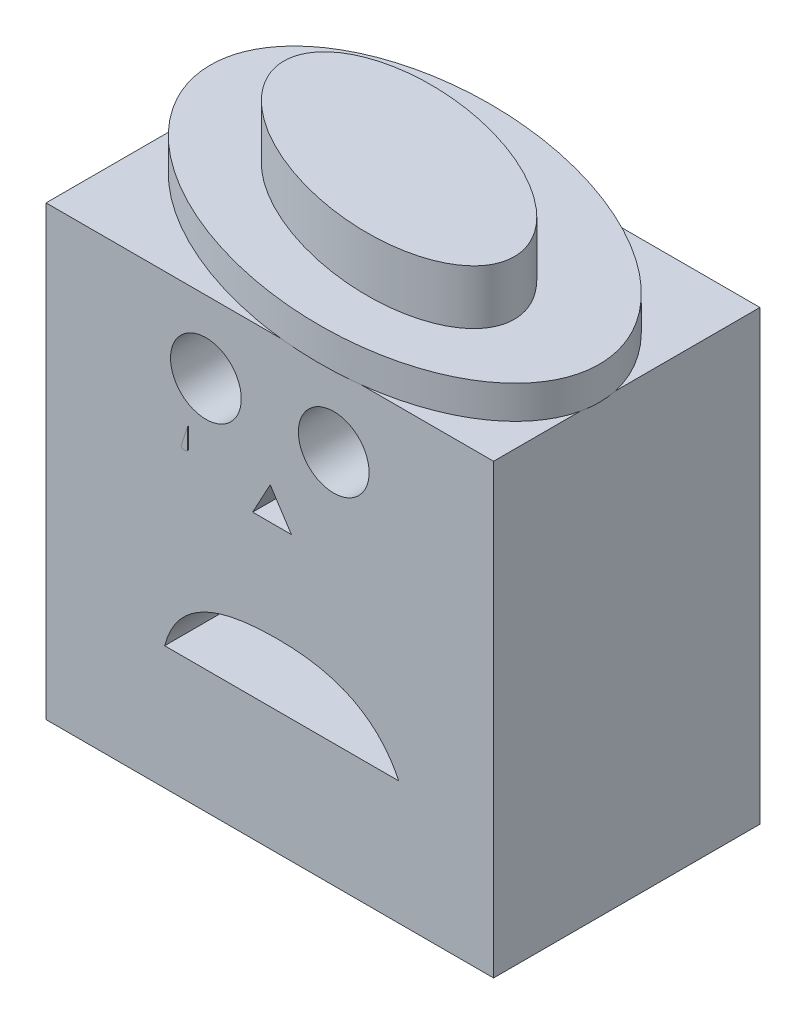
ISO-10303-21;
HEADER;
FILE_DESCRIPTION(('STEP AP214'),'2;1');
FILE_NAME('part.step','',(''),(''),'','','');
FILE_SCHEMA(('AUTOMOTIVE_DESIGN { 1 0 10303 214 1 1 1 1 }'));
ENDSEC;
DATA;
#1=APPLICATION_CONTEXT('core data for automotive mechanical design processes');
#2=APPLICATION_PROTOCOL_DEFINITION('international standard','automotive_design',2000,#1);
#3=PRODUCT_CONTEXT('',#1,'mechanical');
#4=PRODUCT('Part','Part','',(#3));
#5=PRODUCT_RELATED_PRODUCT_CATEGORY('part','',(#4));
#6=PRODUCT_DEFINITION_FORMATION('','',#4);
#7=PRODUCT_DEFINITION_CONTEXT('part definition',#1,'design');
#8=PRODUCT_DEFINITION('design','',#6,#7);
#9=PRODUCT_DEFINITION_SHAPE('','',#8);
#10=(LENGTH_UNIT() NAMED_UNIT(*) SI_UNIT(.MILLI.,.METRE.));
#11=(NAMED_UNIT(*) PLANE_ANGLE_UNIT() SI_UNIT($,.RADIAN.));
#12=(NAMED_UNIT(*) SI_UNIT($,.STERADIAN.) SOLID_ANGLE_UNIT());
#13=UNCERTAINTY_MEASURE_WITH_UNIT(LENGTH_MEASURE(1.E-05),#10,'distance_accuracy_value','');
#14=(GEOMETRIC_REPRESENTATION_CONTEXT(3) GLOBAL_UNCERTAINTY_ASSIGNED_CONTEXT((#13)) GLOBAL_UNIT_ASSIGNED_CONTEXT((#10,
#11,#12)) REPRESENTATION_CONTEXT('',''));
#15=CARTESIAN_POINT('',(0.,0.,0.));
#16=DIRECTION('',(0.,0.,1.));
#17=DIRECTION('',(1.,0.,0.));
#18=AXIS2_PLACEMENT_3D('',#15,#16,#17);
#19=CARTESIAN_POINT('',(0.,773.504412842968,250.));
#20=DIRECTION('',(0.,1.,0.));
#21=DIRECTION('',(0.,0.,1.));
#22=AXIS2_PLACEMENT_3D('',#19,#20,#21);
#23=PLANE('',#22);
#24=CARTESIAN_POINT('',(-1047.35609816267,773.504412842968,122.204602031984));
#25=DIRECTION('',(0.,1.,0.));
#26=DIRECTION('',(-0.977312702499414,0.,-0.211801514473557));
#27=AXIS2_PLACEMENT_3D('',#24,#25,#26);
#28=ELLIPSE('',#27,216.159218744003,124.438636569424);
#29=CARTESIAN_POINT('',(-1256.27696926069,773.504412842968,116.689341842527));
#30=VERTEX_POINT('',#29);
#31=CARTESIAN_POINT('',(-1035.93498476516,773.504412842968,250.));
#32=VERTEX_POINT('',#31);
#33=EDGE_CURVE('E190',#30,#32,#28,.T.);
#34=ORIENTED_EDGE('',*,*,#33,.F.);
#35=DIRECTION('',(0.,0.,-1.));
#36=VECTOR('',#35,1.);
#37=CARTESIAN_POINT('',(-1256.27696926069,773.504412842968,250.));
#38=LINE('',#37,#36);
#39=CARTESIAN_POINT('',(-1256.27696926069,773.504412842968,250.));
#40=VERTEX_POINT('',#39);
#41=EDGE_CURVE('E172',#40,#30,#38,.T.);
#42=ORIENTED_EDGE('',*,*,#41,.F.);
#43=DIRECTION('',(1.,0.,0.));
#44=VECTOR('',#43,1.);
#45=CARTESIAN_POINT('',(0.,773.504412842968,250.));
#46=LINE('',#45,#44);
#47=EDGE_CURVE('E416',#40,#32,#46,.T.);
#48=ORIENTED_EDGE('',*,*,#47,.T.);
#49=EDGE_LOOP('',(#34,#42,#48));
#50=FACE_BOUND('',#49,.T.);
#51=ADVANCED_FACE('F37',(#50),#23,.T.);
#52=CARTESIAN_POINT('',(-960.900420100236,773.504412842968,250.));
#53=VERTEX_POINT('',#52);
#54=CARTESIAN_POINT('',(-836.276969260691,773.504412842968,168.778046732365));
#55=VERTEX_POINT('',#54);
#56=EDGE_CURVE('E11',#53,#55,#28,.T.);
#57=ORIENTED_EDGE('',*,*,#56,.F.);
#58=CARTESIAN_POINT('',(-836.276969260691,773.504412842968,250.));
#59=VERTEX_POINT('',#58);
#60=EDGE_CURVE('E415',#53,#59,#46,.T.);
#61=ORIENTED_EDGE('',*,*,#60,.T.);
#62=DIRECTION('',(0.,0.,-1.));
#63=VECTOR('',#62,1.);
#64=CARTESIAN_POINT('',(-836.276969260691,773.504412842968,250.));
#65=LINE('',#64,#63);
#66=EDGE_CURVE('E209',#59,#55,#65,.T.);
#67=ORIENTED_EDGE('',*,*,#66,.T.);
#68=EDGE_LOOP('',(#57,#61,#67));
#69=FACE_BOUND('',#68,.T.);
#70=ADVANCED_FACE('F304',(#69),#23,.T.);
#71=CARTESIAN_POINT('',(-836.276969260691,773.504412842968,135.862728806255));
#72=VERTEX_POINT('',#71);
#73=CARTESIAN_POINT('',(-1023.7686589662,773.504412842968,0.));
#74=VERTEX_POINT('',#73);
#75=EDGE_CURVE('E46',#72,#74,#28,.T.);
#76=ORIENTED_EDGE('',*,*,#75,.F.);
#77=CARTESIAN_POINT('',(-836.276969260691,773.504412842968,0.));
#78=VERTEX_POINT('',#77);
#79=EDGE_CURVE('E210',#72,#78,#65,.T.);
#80=ORIENTED_EDGE('',*,*,#79,.T.);
#81=DIRECTION('',(1.,0.,0.));
#82=VECTOR('',#81,1.);
#83=CARTESIAN_POINT('',(0.,773.504412842968,0.));
#84=LINE('',#83,#82);
#85=EDGE_CURVE('E261',#74,#78,#84,.T.);
#86=ORIENTED_EDGE('',*,*,#85,.F.);
#87=EDGE_LOOP('',(#76,#80,#86));
#88=FACE_BOUND('',#87,.T.);
#89=ADVANCED_FACE('F310',(#88),#23,.T.);
#90=CARTESIAN_POINT('',(0.,0.,250.));
#91=DIRECTION('',(0.,0.,1.));
#92=DIRECTION('',(1.,0.,0.));
#93=AXIS2_PLACEMENT_3D('',#90,#91,#92);
#94=PLANE('',#93);
#95=CARTESIAN_POINT('',(-986.276969260691,705.792386226511,250.));
#96=DIRECTION('',(0.,0.,1.));
#97=DIRECTION('',(1.,0.,0.));
#98=AXIS2_PLACEMENT_3D('',#95,#96,#97);
#99=CIRCLE('',#98,33.2031338773999);
#100=CARTESIAN_POINT('',(-953.073835383291,705.792386226511,250.));
#101=VERTEX_POINT('',#100);
#102=EDGE_CURVE('E272',#101,#101,#99,.T.);
#103=ORIENTED_EDGE('',*,*,#102,.F.);
#104=EDGE_LOOP('',(#103));
#105=FACE_BOUND('',#104,.T.);
#106=CARTESIAN_POINT('',(-1106.27696926069,705.792386226511,250.));
#107=DIRECTION('',(0.,0.,1.));
#108=DIRECTION('',(1.,0.,0.));
#109=AXIS2_PLACEMENT_3D('',#106,#107,#108);
#110=CIRCLE('',#109,33.2031338773999);
#111=CARTESIAN_POINT('',(-1073.07383538329,705.792386226511,250.));
#112=VERTEX_POINT('',#111);
#113=EDGE_CURVE('E399',#112,#112,#110,.T.);
#114=ORIENTED_EDGE('',*,*,#113,.F.);
#115=EDGE_LOOP('',(#114));
#116=FACE_BOUND('',#115,.T.);
#117=DIRECTION('',(-0.546308724832214,0.83758389261745,0.));
#118=VECTOR('',#117,1.);
#119=CARTESIAN_POINT('',(-436.513870202283,-284.713373673604,250.));
#120=LINE('',#119,#118);
#121=CARTESIAN_POINT('',(-1026.00713709809,619.079743139633,250.));
#122=VERTEX_POINT('',#121);
#123=CARTESIAN_POINT('',(-1045.88994445767,649.563457617213,250.));
#124=VERTEX_POINT('',#123);
#125=EDGE_CURVE('E402',#122,#124,#120,.T.);
#126=ORIENTED_EDGE('',*,*,#125,.F.);
#127=DIRECTION('',(-1.,0.,0.));
#128=VECTOR('',#127,1.);
#129=CARTESIAN_POINT('',(0.,619.079743139633,250.));
#130=LINE('',#129,#128);
#131=CARTESIAN_POINT('',(-1062.40195646636,619.079743139633,250.));
#132=VERTEX_POINT('',#131);
#133=EDGE_CURVE('E232',#122,#132,#130,.T.);
#134=ORIENTED_EDGE('',*,*,#133,.T.);
#135=DIRECTION('',(-0.476283148540754,-0.879291966536773,0.));
#136=VECTOR('',#135,1.);
#137=CARTESIAN_POINT('',(-1080.66631783112,585.360922158528,250.));
#138=LINE('',#137,#136);
#139=EDGE_CURVE('E405',#124,#132,#138,.T.);
#140=ORIENTED_EDGE('',*,*,#139,.F.);
#141=EDGE_LOOP('',(#126,#134,#140));
#142=FACE_BOUND('',#141,.T.);
#143=DIRECTION('',(0.,-1.,0.));
#144=VECTOR('',#143,1.);
#145=CARTESIAN_POINT('',(-1256.27696926069,0.,250.));
#146=LINE('',#145,#144);
#147=CARTESIAN_POINT('',(-1256.27696926069,353.504412842968,250.));
#148=VERTEX_POINT('',#147);
#149=EDGE_CURVE('E407',#40,#148,#146,.T.);
#150=ORIENTED_EDGE('',*,*,#149,.T.);
#151=DIRECTION('',(1.,0.,0.));
#152=VECTOR('',#151,1.);
#153=CARTESIAN_POINT('',(0.,353.504412842968,250.));
#154=LINE('',#153,#152);
#155=CARTESIAN_POINT('',(-836.27696926069,353.504412842968,250.));
#156=VERTEX_POINT('',#155);
#157=EDGE_CURVE('E410',#148,#156,#154,.T.);
#158=ORIENTED_EDGE('',*,*,#157,.T.);
#159=DIRECTION('',(0.,-1.,0.));
#160=VECTOR('',#159,1.);
#161=CARTESIAN_POINT('',(-836.27696926069,-8.84241853559011E-13,250.));
#162=LINE('',#161,#160);
#163=EDGE_CURVE('E412',#59,#156,#162,.T.);
#164=ORIENTED_EDGE('',*,*,#163,.F.);
#165=ORIENTED_EDGE('',*,*,#60,.F.);
#166=EDGE_CURVE('E419',#32,#53,#46,.T.);
#167=ORIENTED_EDGE('',*,*,#166,.F.);
#168=ORIENTED_EDGE('',*,*,#47,.F.);
#169=EDGE_LOOP('',(#150,#158,#164,#165,#167,#168));
#170=FACE_BOUND('',#169,.T.);
#171=DIRECTION('',(1.,0.,0.));
#172=VECTOR('',#171,1.);
#173=CARTESIAN_POINT('',(0.,469.201480291531,250.));
#174=LINE('',#173,#172);
#175=CARTESIAN_POINT('',(-1144.9620165098,469.201480291531,250.));
#176=VERTEX_POINT('',#175);
#177=CARTESIAN_POINT('',(-925.225241317248,469.201480291531,250.));
#178=VERTEX_POINT('',#177);
#179=EDGE_CURVE('E282',#176,#178,#174,.T.);
#180=ORIENTED_EDGE('',*,*,#179,.F.);
#181=CARTESIAN_POINT('',(-1144.9620165098,469.201480291531,250.));
#182=CARTESIAN_POINT('',(-1132.83475985093,516.05542368891,250.));
#183=CARTESIAN_POINT('',(-1038.44686364961,538.622906956385,250.));
#184=CARTESIAN_POINT('',(-948.523344562833,517.634809157185,250.));
#185=CARTESIAN_POINT('',(-925.225241317248,469.201480291531,250.));
#186=B_SPLINE_CURVE_WITH_KNOTS('',3,(#181,#182,#183,#184,#185),.UNSPECIFIED.,.F.,.F.,(4,1,4),
(0.,0.46570079791923,1.),.UNSPECIFIED.);
#187=EDGE_CURVE('E220',#176,#178,#186,.T.);
#188=ORIENTED_EDGE('',*,*,#187,.T.);
#189=EDGE_LOOP('',(#180,#188));
#190=FACE_BOUND('',#189,.T.);
#191=DIRECTION('',(-0.307820285414676,-0.951444518554407,0.));
#192=VECTOR('',#191,1.);
#193=CARTESIAN_POINT('',(-1122.46285109865,659.218542914736,250.));
#194=LINE('',#193,#192);
#195=CARTESIAN_POINT('',(-1122.46285109865,659.218542914736,250.));
#196=VERTEX_POINT('',#195);
#197=CARTESIAN_POINT('',(-1128.53905910145,640.437536360622,250.));
#198=VERTEX_POINT('',#197);
#199=EDGE_CURVE('E366',#196,#198,#194,.T.);
#200=ORIENTED_EDGE('',*,*,#199,.F.);
#201=DIRECTION('',(0.,1.,0.));
#202=VECTOR('',#201,1.);
#203=CARTESIAN_POINT('',(-1122.46285109865,640.00068957891,250.));
#204=LINE('',#203,#202);
#205=CARTESIAN_POINT('',(-1122.46285109865,640.00068957891,250.));
#206=VERTEX_POINT('',#205);
#207=EDGE_CURVE('E202',#206,#196,#204,.T.);
#208=ORIENTED_EDGE('',*,*,#207,.F.);
#209=CARTESIAN_POINT('',(-1123.46285109865,640.00068957891,250.));
#210=DIRECTION('',(0.,0.,-1.));
#211=DIRECTION('',(-1.,0.,0.));
#212=AXIS2_PLACEMENT_3D('',#209,#210,#211);
#213=CIRCLE('',#212,0.999999999999729);
#214=CARTESIAN_POINT('',(-1122.97986029109,639.125064156817,250.));
#215=VERTEX_POINT('',#214);
#216=EDGE_CURVE('E377',#206,#215,#213,.T.);
#217=ORIENTED_EDGE('',*,*,#216,.T.);
#218=CARTESIAN_POINT('',(-1128.12863575861,639.288707105319,250.));
#219=CARTESIAN_POINT('',(-1127.2903383608,638.749430284266,250.));
#220=CARTESIAN_POINT('',(-1125.5822552632,638.182981390083,250.));
#221=CARTESIAN_POINT('',(-1123.85780321633,638.640795025577,250.));
#222=CARTESIAN_POINT('',(-1122.97986029109,639.125064156817,250.));
#223=B_SPLINE_CURVE_WITH_KNOTS('',3,(#218,#219,#220,#221,#222),.UNSPECIFIED.,.F.,.F.,(4,1,4),
(0.103294073645158,0.511857069824513,0.920052958878738),.UNSPECIFIED.);
#224=CARTESIAN_POINT('',(-1128.12863575861,639.288707105319,250.));
#225=VERTEX_POINT('',#224);
#226=EDGE_CURVE('E372',#225,#215,#223,.T.);
#227=ORIENTED_EDGE('',*,*,#226,.F.);
#228=CARTESIAN_POINT('',(-1127.5876145829,640.129716075207,250.));
#229=DIRECTION('',(0.,0.,1.));
#230=DIRECTION('',(1.,0.,0.));
#231=AXIS2_PLACEMENT_3D('',#228,#229,#230);
#232=CIRCLE('',#231,1.00000000000021);
#233=EDGE_CURVE('E369',#198,#225,#232,.T.);
#234=ORIENTED_EDGE('',*,*,#233,.F.);
#235=EDGE_LOOP('',(#200,#208,#217,#227,#234));
#236=FACE_BOUND('',#235,.T.);
#237=ADVANCED_FACE('F324',(#105,#116,#142,#170,#190,#236),#94,.T.);
#238=CARTESIAN_POINT('',(0.,469.201480291531,250.));
#239=DIRECTION('',(0.,1.,0.));
#240=DIRECTION('',(0.,0.,1.));
#241=AXIS2_PLACEMENT_3D('',#238,#239,#240);
#242=PLANE('',#241);
#243=DIRECTION('',(1.,0.,0.));
#244=VECTOR('',#243,1.);
#245=CARTESIAN_POINT('',(0.,469.201480291531,0.));
#246=LINE('',#245,#244);
#247=CARTESIAN_POINT('',(-1144.9620165098,469.201480291531,0.));
#248=VERTEX_POINT('',#247);
#249=CARTESIAN_POINT('',(-925.225241317248,469.201480291531,0.));
#250=VERTEX_POINT('',#249);
#251=EDGE_CURVE('E263',#248,#250,#246,.T.);
#252=ORIENTED_EDGE('',*,*,#251,.F.);
#253=DIRECTION('',(0.,0.,-1.));
#254=VECTOR('',#253,1.);
#255=CARTESIAN_POINT('',(-1144.9620165098,469.201480291531,250.));
#256=LINE('',#255,#254);
#257=EDGE_CURVE('E194',#176,#248,#256,.T.);
#258=ORIENTED_EDGE('',*,*,#257,.F.);
#259=ORIENTED_EDGE('',*,*,#179,.T.);
#260=DIRECTION('',(0.,0.,-1.));
#261=VECTOR('',#260,1.);
#262=CARTESIAN_POINT('',(-925.225241317248,469.201480291531,250.));
#263=LINE('',#262,#261);
#264=EDGE_CURVE('E195',#178,#250,#263,.T.);
#265=ORIENTED_EDGE('',*,*,#264,.T.);
#266=EDGE_LOOP('',(#252,#258,#259,#265));
#267=FACE_BOUND('',#266,.T.);
#268=ADVANCED_FACE('F280',(#267),#242,.T.);
#269=CARTESIAN_POINT('',(-1256.27696926069,0.,250.));
#270=DIRECTION('',(1.,0.,0.));
#271=DIRECTION('',(0.,0.,-1.));
#272=AXIS2_PLACEMENT_3D('',#269,#270,#271);
#273=PLANE('',#272);
#274=DIRECTION('',(0.,-1.,0.));
#275=VECTOR('',#274,1.);
#276=CARTESIAN_POINT('',(-1256.27696926069,0.,0.));
#277=LINE('',#276,#275);
#278=CARTESIAN_POINT('',(-1256.27696926069,773.504412842968,0.));
#279=VERTEX_POINT('',#278);
#280=CARTESIAN_POINT('',(-1256.27696926069,353.504412842968,0.));
#281=VERTEX_POINT('',#280);
#282=EDGE_CURVE('E253',#279,#281,#277,.T.);
#283=ORIENTED_EDGE('',*,*,#282,.T.);
#284=DIRECTION('',(0.,0.,-1.));
#285=VECTOR('',#284,1.);
#286=CARTESIAN_POINT('',(-1256.27696926069,353.504412842968,250.));
#287=LINE('',#286,#285);
#288=EDGE_CURVE('E215',#148,#281,#287,.T.);
#289=ORIENTED_EDGE('',*,*,#288,.F.);
#290=ORIENTED_EDGE('',*,*,#149,.F.);
#291=ORIENTED_EDGE('',*,*,#41,.T.);
#292=CARTESIAN_POINT('',(-1256.27696926069,773.504412842968,68.1041510635131));
#293=VERTEX_POINT('',#292);
#294=EDGE_CURVE('E165',#30,#293,#38,.T.);
#295=ORIENTED_EDGE('',*,*,#294,.T.);
#296=EDGE_CURVE('E169',#293,#279,#38,.T.);
#297=ORIENTED_EDGE('',*,*,#296,.T.);
#298=EDGE_LOOP('',(#283,#289,#290,#291,#295,#297));
#299=FACE_BOUND('',#298,.T.);
#300=ADVANCED_FACE('F168',(#299),#273,.F.);
#301=CARTESIAN_POINT('',(0.,353.504412842968,250.));
#302=DIRECTION('',(0.,1.,0.));
#303=DIRECTION('',(0.,0.,1.));
#304=AXIS2_PLACEMENT_3D('',#301,#302,#303);
#305=PLANE('',#304);
#306=DIRECTION('',(1.,0.,0.));
#307=VECTOR('',#306,1.);
#308=CARTESIAN_POINT('',(0.,353.504412842968,0.));
#309=LINE('',#308,#307);
#310=CARTESIAN_POINT('',(-836.27696926069,353.504412842968,0.));
#311=VERTEX_POINT('',#310);
#312=EDGE_CURVE('E255',#281,#311,#309,.T.);
#313=ORIENTED_EDGE('',*,*,#312,.T.);
#314=DIRECTION('',(0.,0.,-1.));
#315=VECTOR('',#314,1.);
#316=CARTESIAN_POINT('',(-836.27696926069,353.504412842968,250.));
#317=LINE('',#316,#315);
#318=EDGE_CURVE('E212',#156,#311,#317,.T.);
#319=ORIENTED_EDGE('',*,*,#318,.F.);
#320=ORIENTED_EDGE('',*,*,#157,.F.);
#321=ORIENTED_EDGE('',*,*,#288,.T.);
#322=EDGE_LOOP('',(#313,#319,#320,#321));
#323=FACE_BOUND('',#322,.T.);
#324=ADVANCED_FACE('F444',(#323),#305,.F.);
#325=CARTESIAN_POINT('',(-836.27696926069,-8.84241853559011E-13,250.));
#326=DIRECTION('',(1.,0.,0.));
#327=DIRECTION('',(0.,1.,0.));
#328=AXIS2_PLACEMENT_3D('',#325,#326,#327);
#329=PLANE('',#328);
#330=DIRECTION('',(0.,-1.,0.));
#331=VECTOR('',#330,1.);
#332=CARTESIAN_POINT('',(-836.27696926069,-8.84241853559011E-13,0.));
#333=LINE('',#332,#331);
#334=EDGE_CURVE('E258',#78,#311,#333,.T.);
#335=ORIENTED_EDGE('',*,*,#334,.F.);
#336=ORIENTED_EDGE('',*,*,#79,.F.);
#337=EDGE_CURVE('E61',#55,#72,#65,.T.);
#338=ORIENTED_EDGE('',*,*,#337,.F.);
#339=ORIENTED_EDGE('',*,*,#66,.F.);
#340=ORIENTED_EDGE('',*,*,#163,.T.);
#341=ORIENTED_EDGE('',*,*,#318,.T.);
#342=EDGE_LOOP('',(#335,#336,#338,#339,#340,#341));
#343=FACE_BOUND('',#342,.T.);
#344=ADVANCED_FACE('F440',(#343),#329,.T.);
#345=CARTESIAN_POINT('',(-436.513870202283,-284.713373673604,250.));
#346=DIRECTION('',(-0.83758389261745,-0.546308724832214,0.));
#347=DIRECTION('',(0.546308724832214,-0.83758389261745,0.));
#348=AXIS2_PLACEMENT_3D('',#345,#346,#347);
#349=PLANE('',#348);
#350=DIRECTION('',(-0.546308724832214,0.83758389261745,0.));
#351=VECTOR('',#350,1.);
#352=CARTESIAN_POINT('',(-436.513870202283,-284.713373673604,0.));
#353=LINE('',#352,#351);
#354=CARTESIAN_POINT('',(-1026.00713709809,619.079743139633,0.));
#355=VERTEX_POINT('',#354);
#356=CARTESIAN_POINT('',(-1045.88994445767,649.563457617213,0.));
#357=VERTEX_POINT('',#356);
#358=EDGE_CURVE('E241',#355,#357,#353,.T.);
#359=ORIENTED_EDGE('',*,*,#358,.F.);
#360=DIRECTION('',(0.,0.,-1.));
#361=VECTOR('',#360,1.);
#362=CARTESIAN_POINT('',(-1026.00713709809,619.079743139633,250.));
#363=LINE('',#362,#361);
#364=EDGE_CURVE('E41',#122,#355,#363,.T.);
#365=ORIENTED_EDGE('',*,*,#364,.F.);
#366=ORIENTED_EDGE('',*,*,#125,.T.);
#367=DIRECTION('',(0.,0.,-1.));
#368=VECTOR('',#367,1.);
#369=CARTESIAN_POINT('',(-1045.88994445767,649.563457617213,250.));
#370=LINE('',#369,#368);
#371=EDGE_CURVE('E218',#124,#357,#370,.T.);
#372=ORIENTED_EDGE('',*,*,#371,.T.);
#373=EDGE_LOOP('',(#359,#365,#366,#372));
#374=FACE_BOUND('',#373,.T.);
#375=ADVANCED_FACE('F244',(#374),#349,.T.);
#376=CARTESIAN_POINT('',(0.,619.079743139633,250.));
#377=DIRECTION('',(0.,-1.,0.));
#378=DIRECTION('',(0.,0.,-1.));
#379=AXIS2_PLACEMENT_3D('',#376,#377,#378);
#380=PLANE('',#379);
#381=DIRECTION('',(-1.,0.,0.));
#382=VECTOR('',#381,1.);
#383=CARTESIAN_POINT('',(0.,619.079743139633,0.));
#384=LINE('',#383,#382);
#385=CARTESIAN_POINT('',(-1062.40195646636,619.079743139633,0.));
#386=VERTEX_POINT('',#385);
#387=EDGE_CURVE('E230',#355,#386,#384,.T.);
#388=ORIENTED_EDGE('',*,*,#387,.T.);
#389=DIRECTION('',(0.,0.,-1.));
#390=VECTOR('',#389,1.);
#391=CARTESIAN_POINT('',(-1062.40195646636,619.079743139633,250.));
#392=LINE('',#391,#390);
#393=EDGE_CURVE('E219',#132,#386,#392,.T.);
#394=ORIENTED_EDGE('',*,*,#393,.F.);
#395=ORIENTED_EDGE('',*,*,#133,.F.);
#396=ORIENTED_EDGE('',*,*,#364,.T.);
#397=EDGE_LOOP('',(#388,#394,#395,#396));
#398=FACE_BOUND('',#397,.T.);
#399=ADVANCED_FACE('F229',(#398),#380,.F.);
#400=CARTESIAN_POINT('',(-1164.53841275147,773.504412842968,0.));
#401=VERTEX_POINT('',#400);
#402=EDGE_CURVE('E181',#401,#293,#28,.T.);
#403=ORIENTED_EDGE('',*,*,#402,.F.);
#404=EDGE_CURVE('E183',#279,#401,#84,.T.);
#405=ORIENTED_EDGE('',*,*,#404,.F.);
#406=ORIENTED_EDGE('',*,*,#296,.F.);
#407=EDGE_LOOP('',(#403,#405,#406));
#408=FACE_BOUND('',#407,.T.);
#409=ADVANCED_FACE('F179',(#408),#23,.T.);
#410=CARTESIAN_POINT('',(-1080.66631783112,585.360922158528,250.));
#411=DIRECTION('',(0.879291966536773,-0.476283148540754,0.));
#412=DIRECTION('',(0.476283148540754,0.879291966536773,0.));
#413=AXIS2_PLACEMENT_3D('',#410,#411,#412);
#414=PLANE('',#413);
#415=DIRECTION('',(-0.476283148540754,-0.879291966536773,0.));
#416=VECTOR('',#415,1.);
#417=CARTESIAN_POINT('',(-1080.66631783112,585.360922158528,0.));
#418=LINE('',#417,#416);
#419=EDGE_CURVE('E242',#357,#386,#418,.T.);
#420=ORIENTED_EDGE('',*,*,#419,.F.);
#421=ORIENTED_EDGE('',*,*,#371,.F.);
#422=ORIENTED_EDGE('',*,*,#139,.T.);
#423=ORIENTED_EDGE('',*,*,#393,.T.);
#424=EDGE_LOOP('',(#420,#421,#422,#423));
#425=FACE_BOUND('',#424,.T.);
#426=ADVANCED_FACE('F315',(#425),#414,.T.);
#427=CARTESIAN_POINT('',(-1106.27696926069,705.792386226511,250.));
#428=DIRECTION('',(0.,0.,-1.));
#429=DIRECTION('',(-1.,0.,0.));
#430=AXIS2_PLACEMENT_3D('',#427,#428,#429);
#431=CYLINDRICAL_SURFACE('',#430,33.2031338773999);
#432=ORIENTED_EDGE('',*,*,#113,.T.);
#433=EDGE_LOOP('',(#432));
#434=FACE_BOUND('',#433,.T.);
#435=CARTESIAN_POINT('',(-1106.27696926069,705.792386226511,0.));
#436=DIRECTION('',(0.,0.,1.));
#437=DIRECTION('',(1.,0.,0.));
#438=AXIS2_PLACEMENT_3D('',#435,#436,#437);
#439=CIRCLE('',#438,33.2031338773999);
#440=CARTESIAN_POINT('',(-1073.07383538329,705.792386226511,0.));
#441=VERTEX_POINT('',#440);
#442=EDGE_CURVE('E245',#441,#441,#439,.T.);
#443=ORIENTED_EDGE('',*,*,#442,.F.);
#444=EDGE_LOOP('',(#443));
#445=FACE_BOUND('',#444,.T.);
#446=ADVANCED_FACE('F320',(#434,#445),#431,.F.);
#447=CARTESIAN_POINT('',(-986.276969260691,705.792386226511,250.));
#448=DIRECTION('',(0.,0.,-1.));
#449=DIRECTION('',(-1.,0.,0.));
#450=AXIS2_PLACEMENT_3D('',#447,#448,#449);
#451=CYLINDRICAL_SURFACE('',#450,33.2031338773999);
#452=ORIENTED_EDGE('',*,*,#102,.T.);
#453=EDGE_LOOP('',(#452));
#454=FACE_BOUND('',#453,.T.);
#455=CARTESIAN_POINT('',(-986.276969260691,705.792386226511,0.));
#456=DIRECTION('',(0.,0.,1.));
#457=DIRECTION('',(1.,0.,0.));
#458=AXIS2_PLACEMENT_3D('',#455,#456,#457);
#459=CIRCLE('',#458,33.2031338773999);
#460=CARTESIAN_POINT('',(-953.073835383291,705.792386226511,0.));
#461=VERTEX_POINT('',#460);
#462=EDGE_CURVE('E248',#461,#461,#459,.T.);
#463=ORIENTED_EDGE('',*,*,#462,.F.);
#464=EDGE_LOOP('',(#463));
#465=FACE_BOUND('',#464,.T.);
#466=ADVANCED_FACE('F39',(#454,#465),#451,.F.);
#467=DIRECTION('',(0.,0.,-1.));
#468=VECTOR('',#467,1.);
#469=SURFACE_OF_LINEAR_EXTRUSION('',#186,#468);
#470=CARTESIAN_POINT('',(-1144.9620165098,469.201480291531,0.));
#471=CARTESIAN_POINT('',(-1132.83475985093,516.05542368891,0.));
#472=CARTESIAN_POINT('',(-1038.44686364961,538.622906956385,0.));
#473=CARTESIAN_POINT('',(-948.523344562833,517.634809157185,0.));
#474=CARTESIAN_POINT('',(-925.225241317248,469.201480291531,0.));
#475=B_SPLINE_CURVE_WITH_KNOTS('',3,(#470,#471,#472,#473,#474),.UNSPECIFIED.,.F.,.F.,(4,1,4),
(0.,0.46570079791923,1.),.UNSPECIFIED.);
#476=EDGE_CURVE('E267',#248,#250,#475,.T.);
#477=ORIENTED_EDGE('',*,*,#476,.T.);
#478=ORIENTED_EDGE('',*,*,#264,.F.);
#479=ORIENTED_EDGE('',*,*,#187,.F.);
#480=ORIENTED_EDGE('',*,*,#257,.T.);
#481=EDGE_LOOP('',(#477,#478,#479,#480));
#482=FACE_BOUND('',#481,.T.);
#483=ADVANCED_FACE('F286',(#482),#469,.F.);
#484=CARTESIAN_POINT('',(0.,0.,0.));
#485=DIRECTION('',(0.,0.,1.));
#486=DIRECTION('',(1.,0.,0.));
#487=AXIS2_PLACEMENT_3D('',#484,#485,#486);
#488=PLANE('',#487);
#489=ORIENTED_EDGE('',*,*,#462,.T.);
#490=EDGE_LOOP('',(#489));
#491=FACE_BOUND('',#490,.T.);
#492=ORIENTED_EDGE('',*,*,#442,.T.);
#493=EDGE_LOOP('',(#492));
#494=FACE_BOUND('',#493,.T.);
#495=ORIENTED_EDGE('',*,*,#358,.T.);
#496=ORIENTED_EDGE('',*,*,#419,.T.);
#497=ORIENTED_EDGE('',*,*,#387,.F.);
#498=EDGE_LOOP('',(#495,#496,#497));
#499=FACE_BOUND('',#498,.T.);
#500=ORIENTED_EDGE('',*,*,#282,.F.);
#501=ORIENTED_EDGE('',*,*,#404,.T.);
#502=EDGE_CURVE('E264',#401,#74,#84,.T.);
#503=ORIENTED_EDGE('',*,*,#502,.T.);
#504=ORIENTED_EDGE('',*,*,#85,.T.);
#505=ORIENTED_EDGE('',*,*,#334,.T.);
#506=ORIENTED_EDGE('',*,*,#312,.F.);
#507=EDGE_LOOP('',(#500,#501,#503,#504,#505,#506));
#508=FACE_BOUND('',#507,.T.);
#509=ORIENTED_EDGE('',*,*,#251,.T.);
#510=ORIENTED_EDGE('',*,*,#476,.F.);
#511=EDGE_LOOP('',(#509,#510));
#512=FACE_BOUND('',#511,.T.);
#513=ADVANCED_FACE('F239',(#491,#494,#499,#508,#512),#488,.F.);
#514=CARTESIAN_POINT('',(-1122.46285109865,640.00068957891,251.));
#515=DIRECTION('',(-1.,0.,0.));
#516=DIRECTION('',(0.,0.,1.));
#517=AXIS2_PLACEMENT_3D('',#514,#515,#516);
#518=PLANE('',#517);
#519=ORIENTED_EDGE('',*,*,#207,.T.);
#520=DIRECTION('',(0.,0.,-1.));
#521=VECTOR('',#520,1.);
#522=CARTESIAN_POINT('',(-1122.46285109865,659.218542914736,251.));
#523=LINE('',#522,#521);
#524=CARTESIAN_POINT('',(-1122.46285109865,659.218542914736,251.));
#525=VERTEX_POINT('',#524);
#526=EDGE_CURVE('E394',#525,#196,#523,.T.);
#527=ORIENTED_EDGE('',*,*,#526,.F.);
#528=DIRECTION('',(0.,1.,0.));
#529=VECTOR('',#528,1.);
#530=CARTESIAN_POINT('',(-1122.46285109865,640.00068957891,251.));
#531=LINE('',#530,#529);
#532=CARTESIAN_POINT('',(-1122.46285109865,640.00068957891,251.));
#533=VERTEX_POINT('',#532);
#534=EDGE_CURVE('E382',#533,#525,#531,.T.);
#535=ORIENTED_EDGE('',*,*,#534,.F.);
#536=DIRECTION('',(0.,0.,-1.));
#537=VECTOR('',#536,1.);
#538=CARTESIAN_POINT('',(-1122.46285109865,640.00068957891,251.));
#539=LINE('',#538,#537);
#540=EDGE_CURVE('E363',#533,#206,#539,.T.);
#541=ORIENTED_EDGE('',*,*,#540,.T.);
#542=EDGE_LOOP('',(#519,#527,#535,#541));
#543=FACE_BOUND('',#542,.T.);
#544=ADVANCED_FACE('F289',(#543),#518,.F.);
#545=CARTESIAN_POINT('',(-1122.46285109865,659.218542914736,251.));
#546=DIRECTION('',(0.951444518554407,-0.307820285414676,0.));
#547=DIRECTION('',(0.307820285414676,0.951444518554407,0.));
#548=AXIS2_PLACEMENT_3D('',#545,#546,#547);
#549=PLANE('',#548);
#550=ORIENTED_EDGE('',*,*,#199,.T.);
#551=DIRECTION('',(0.,0.,-1.));
#552=VECTOR('',#551,1.);
#553=CARTESIAN_POINT('',(-1128.53905910145,640.437536360622,251.));
#554=LINE('',#553,#552);
#555=CARTESIAN_POINT('',(-1128.53905910145,640.437536360622,251.));
#556=VERTEX_POINT('',#555);
#557=EDGE_CURVE('E391',#556,#198,#554,.T.);
#558=ORIENTED_EDGE('',*,*,#557,.F.);
#559=DIRECTION('',(-0.307820285414676,-0.951444518554407,0.));
#560=VECTOR('',#559,1.);
#561=CARTESIAN_POINT('',(-1122.46285109865,659.218542914736,251.));
#562=LINE('',#561,#560);
#563=EDGE_CURVE('E674',#525,#556,#562,.T.);
#564=ORIENTED_EDGE('',*,*,#563,.F.);
#565=ORIENTED_EDGE('',*,*,#526,.T.);
#566=EDGE_LOOP('',(#550,#558,#564,#565));
#567=FACE_BOUND('',#566,.T.);
#568=ADVANCED_FACE('F296',(#567),#549,.F.);
#569=CARTESIAN_POINT('',(-1127.5876145829,640.129716075207,251.));
#570=DIRECTION('',(0.,0.,-1.));
#571=DIRECTION('',(-1.,0.,0.));
#572=AXIS2_PLACEMENT_3D('',#569,#570,#571);
#573=CYLINDRICAL_SURFACE('',#572,1.00000000000021);
#574=ORIENTED_EDGE('',*,*,#233,.T.);
#575=DIRECTION('',(0.,0.,-1.));
#576=VECTOR('',#575,1.);
#577=CARTESIAN_POINT('',(-1128.12863575861,639.288707105319,251.));
#578=LINE('',#577,#576);
#579=CARTESIAN_POINT('',(-1128.12863575861,639.288707105319,251.));
#580=VERTEX_POINT('',#579);
#581=EDGE_CURVE('E388',#580,#225,#578,.T.);
#582=ORIENTED_EDGE('',*,*,#581,.F.);
#583=CARTESIAN_POINT('',(-1127.5876145829,640.129716075207,251.));
#584=DIRECTION('',(0.,0.,1.));
#585=DIRECTION('',(1.,0.,0.));
#586=AXIS2_PLACEMENT_3D('',#583,#584,#585);
#587=CIRCLE('',#586,1.00000000000021);
#588=EDGE_CURVE('E356',#556,#580,#587,.T.);
#589=ORIENTED_EDGE('',*,*,#588,.F.);
#590=ORIENTED_EDGE('',*,*,#557,.T.);
#591=EDGE_LOOP('',(#574,#582,#589,#590));
#592=FACE_BOUND('',#591,.T.);
#593=ADVANCED_FACE('F337',(#592),#573,.T.);
#594=CARTESIAN_POINT('',(-1128.12863575861,639.288707105319,251.));
#595=CARTESIAN_POINT('',(-1127.2903383608,638.749430284266,251.));
#596=CARTESIAN_POINT('',(-1125.5822552632,638.182981390083,251.));
#597=CARTESIAN_POINT('',(-1123.85780321633,638.640795025577,251.));
#598=CARTESIAN_POINT('',(-1122.97986029109,639.125064156817,251.));
#599=B_SPLINE_CURVE_WITH_KNOTS('',3,(#594,#595,#596,#597,#598),.UNSPECIFIED.,.F.,.F.,(4,1,4),
(0.103294073645158,0.511857069824513,0.920052958878738),.UNSPECIFIED.);
#600=DIRECTION('',(0.,0.,-1.));
#601=VECTOR('',#600,1.);
#602=SURFACE_OF_LINEAR_EXTRUSION('',#599,#601);
#603=ORIENTED_EDGE('',*,*,#226,.T.);
#604=DIRECTION('',(0.,0.,-1.));
#605=VECTOR('',#604,1.);
#606=CARTESIAN_POINT('',(-1122.97986029109,639.125064156817,251.));
#607=LINE('',#606,#605);
#608=CARTESIAN_POINT('',(-1122.97986029109,639.125064156817,251.));
#609=VERTEX_POINT('',#608);
#610=EDGE_CURVE('E385',#609,#215,#607,.T.);
#611=ORIENTED_EDGE('',*,*,#610,.F.);
#612=EDGE_CURVE('E349',#580,#609,#599,.T.);
#613=ORIENTED_EDGE('',*,*,#612,.F.);
#614=ORIENTED_EDGE('',*,*,#581,.T.);
#615=EDGE_LOOP('',(#603,#611,#613,#614));
#616=FACE_BOUND('',#615,.T.);
#617=ADVANCED_FACE('F341',(#616),#602,.F.);
#618=CARTESIAN_POINT('',(-1123.46285109865,640.00068957891,251.));
#619=DIRECTION('',(0.,0.,-1.));
#620=DIRECTION('',(-1.,0.,0.));
#621=AXIS2_PLACEMENT_3D('',#618,#619,#620);
#622=CYLINDRICAL_SURFACE('',#621,0.999999999999729);
#623=ORIENTED_EDGE('',*,*,#216,.F.);
#624=ORIENTED_EDGE('',*,*,#540,.F.);
#625=CARTESIAN_POINT('',(-1123.46285109865,640.00068957891,251.));
#626=DIRECTION('',(0.,0.,-1.));
#627=DIRECTION('',(-1.,0.,0.));
#628=AXIS2_PLACEMENT_3D('',#625,#626,#627);
#629=CIRCLE('',#628,0.999999999999729);
#630=EDGE_CURVE('E355',#533,#609,#629,.T.);
#631=ORIENTED_EDGE('',*,*,#630,.T.);
#632=ORIENTED_EDGE('',*,*,#610,.T.);
#633=EDGE_LOOP('',(#623,#624,#631,#632));
#634=FACE_BOUND('',#633,.T.);
#635=ADVANCED_FACE('F346',(#634),#622,.T.);
#636=CARTESIAN_POINT('',(-1127.5876145829,640.129716075207,251.));
#637=DIRECTION('',(0.,0.,1.));
#638=DIRECTION('',(1.,0.,0.));
#639=AXIS2_PLACEMENT_3D('',#636,#637,#638);
#640=PLANE('',#639);
#641=ORIENTED_EDGE('',*,*,#534,.T.);
#642=ORIENTED_EDGE('',*,*,#563,.T.);
#643=ORIENTED_EDGE('',*,*,#588,.T.);
#644=ORIENTED_EDGE('',*,*,#612,.T.);
#645=ORIENTED_EDGE('',*,*,#630,.F.);
#646=EDGE_LOOP('',(#641,#642,#643,#644,#645));
#647=FACE_BOUND('',#646,.T.);
#648=ADVANCED_FACE('F459',(#647),#640,.T.);
#649=CARTESIAN_POINT('',(-1047.35609816267,773.504412842968,122.204602031984));
#650=DIRECTION('',(0.,1.,0.));
#651=DIRECTION('',(0.,0.,1.));
#652=AXIS2_PLACEMENT_3D('',#649,#650,#651);
#653=PLANE('',#652);
#654=ORIENTED_EDGE('',*,*,#502,.F.);
#655=EDGE_CURVE('E188',#74,#401,#28,.T.);
#656=ORIENTED_EDGE('',*,*,#655,.F.);
#657=EDGE_LOOP('',(#654,#656));
#658=FACE_BOUND('',#657,.T.);
#659=ADVANCED_FACE('F456',(#658),#653,.F.);
#660=EDGE_CURVE('E48',#32,#53,#28,.T.);
#661=ORIENTED_EDGE('',*,*,#660,.F.);
#662=ORIENTED_EDGE('',*,*,#166,.T.);
#663=EDGE_LOOP('',(#661,#662));
#664=FACE_BOUND('',#663,.T.);
#665=ADVANCED_FACE('F458',(#664),#653,.F.);
#666=EDGE_CURVE('E203',#55,#72,#28,.T.);
#667=ORIENTED_EDGE('',*,*,#666,.F.);
#668=ORIENTED_EDGE('',*,*,#337,.T.);
#669=EDGE_LOOP('',(#667,#668));
#670=FACE_BOUND('',#669,.T.);
#671=ADVANCED_FACE('F208',(#670),#653,.F.);
#672=CARTESIAN_POINT('',(-1047.35609816267,804.504412842968,122.204602031984));
#673=DIRECTION('',(0.,1.,0.));
#674=DIRECTION('',(-0.977312702499414,0.,-0.211801514473557));
#675=AXIS2_PLACEMENT_3D('',#672,#673,#674);
#676=ELLIPSE('',#675,216.159218744003,124.438636569424);
#677=DIRECTION('',(0.,-1.,0.));
#678=VECTOR('',#677,1.);
#679=SURFACE_OF_LINEAR_EXTRUSION('',#676,#678);
#680=CARTESIAN_POINT('',(-1258.61124840353,804.504412842968,76.4217521345834));
#681=VERTEX_POINT('',#680);
#682=EDGE_CURVE('E199',#681,#681,#676,.T.);
#683=ORIENTED_EDGE('',*,*,#682,.F.);
#684=EDGE_LOOP('',(#683));
#685=FACE_BOUND('',#684,.T.);
#686=ORIENTED_EDGE('',*,*,#33,.T.);
#687=ORIENTED_EDGE('',*,*,#660,.T.);
#688=ORIENTED_EDGE('',*,*,#56,.T.);
#689=ORIENTED_EDGE('',*,*,#666,.T.);
#690=ORIENTED_EDGE('',*,*,#75,.T.);
#691=ORIENTED_EDGE('',*,*,#655,.T.);
#692=ORIENTED_EDGE('',*,*,#402,.T.);
#693=EDGE_CURVE('E184',#293,#30,#28,.T.);
#694=ORIENTED_EDGE('',*,*,#693,.T.);
#695=EDGE_LOOP('',(#686,#687,#688,#689,#690,#691,#692,#694));
#696=FACE_BOUND('',#695,.T.);
#697=ADVANCED_FACE('F192',(#685,#696),#679,.F.);
#698=CARTESIAN_POINT('',(-1047.35609816267,804.504412842968,122.204602031984));
#699=DIRECTION('',(0.,1.,0.));
#700=DIRECTION('',(0.,0.,1.));
#701=AXIS2_PLACEMENT_3D('',#698,#699,#700);
#702=PLANE('',#701);
#703=CARTESIAN_POINT('',(-1044.40712970745,804.504412842968,130.546272110653));
#704=DIRECTION('',(0.,1.,0.));
#705=DIRECTION('',(0.967941754643742,0.,0.251174759116423));
#706=AXIS2_PLACEMENT_3D('',#703,#704,#705);
#707=ELLIPSE('',#706,136.80879913294,69.0562156003788);
#708=CARTESIAN_POINT('',(-911.984180624009,804.504412842968,164.909189277876));
#709=VERTEX_POINT('',#708);
#710=EDGE_CURVE('E490',#709,#709,#707,.T.);
#711=ORIENTED_EDGE('',*,*,#710,.F.);
#712=EDGE_LOOP('',(#711));
#713=FACE_BOUND('',#712,.T.);
#714=ORIENTED_EDGE('',*,*,#682,.T.);
#715=EDGE_LOOP('',(#714));
#716=FACE_BOUND('',#715,.T.);
#717=ADVANCED_FACE('F471',(#713,#716),#702,.T.);
#718=ORIENTED_EDGE('',*,*,#294,.F.);
#719=ORIENTED_EDGE('',*,*,#693,.F.);
#720=EDGE_LOOP('',(#718,#719));
#721=FACE_BOUND('',#720,.T.);
#722=ADVANCED_FACE('F185',(#721),#653,.F.);
#723=CARTESIAN_POINT('',(-1044.40712970745,855.504412842968,130.546272110653));
#724=DIRECTION('',(0.,1.,0.));
#725=DIRECTION('',(0.967941754643742,0.,0.251174759116423));
#726=AXIS2_PLACEMENT_3D('',#723,#724,#725);
#727=ELLIPSE('',#726,136.80879913294,69.0562156003788);
#728=DIRECTION('',(0.,-1.,0.));
#729=VECTOR('',#728,1.);
#730=SURFACE_OF_LINEAR_EXTRUSION('',#727,#729);
#731=CARTESIAN_POINT('',(-911.984180624009,855.504412842968,164.909189277876));
#732=VERTEX_POINT('',#731);
#733=EDGE_CURVE('E189',#732,#732,#727,.T.);
#734=ORIENTED_EDGE('',*,*,#733,.F.);
#735=EDGE_LOOP('',(#734));
#736=FACE_BOUND('',#735,.T.);
#737=ORIENTED_EDGE('',*,*,#710,.T.);
#738=EDGE_LOOP('',(#737));
#739=FACE_BOUND('',#738,.T.);
#740=ADVANCED_FACE('F470',(#736,#739),#730,.F.);
#741=CARTESIAN_POINT('',(-1044.40712970745,855.504412842968,130.546272110653));
#742=DIRECTION('',(0.,1.,0.));
#743=DIRECTION('',(0.,0.,1.));
#744=AXIS2_PLACEMENT_3D('',#741,#742,#743);
#745=PLANE('',#744);
#746=ORIENTED_EDGE('',*,*,#733,.T.);
#747=EDGE_LOOP('',(#746));
#748=FACE_BOUND('',#747,.T.);
#749=ADVANCED_FACE('F476',(#748),#745,.T.);
#750=CLOSED_SHELL('',(#51,#70,#89,#237,#268,#300,#324,#344,#375,#399,#409,#426,#446,#466,#483,
#513,#544,#568,#593,#617,#635,#648,#659,#665,#671,#697,#717,#722,#740,#749));
#751=MANIFOLD_SOLID_BREP('B2',#750);
#752=ADVANCED_BREP_SHAPE_REPRESENTATION('',(#18,#751),#14);
#753=SHAPE_DEFINITION_REPRESENTATION(#9,#752);
ENDSEC;
END-ISO-10303-21;
